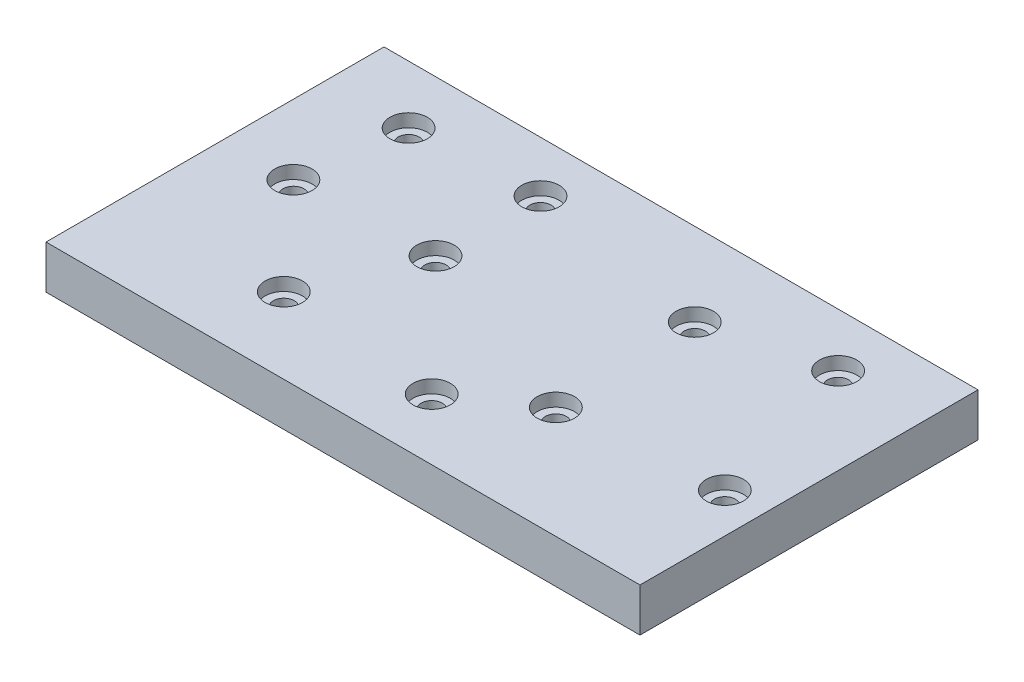
ISO-10303-21;
HEADER;
FILE_DESCRIPTION(('STEP AP214'),'2;1');
FILE_NAME('part.step','',(''),(''),'','','');
FILE_SCHEMA(('AUTOMOTIVE_DESIGN { 1 0 10303 214 1 1 1 1 }'));
ENDSEC;
DATA;
#1=APPLICATION_CONTEXT('core data for automotive mechanical design processes');
#2=APPLICATION_PROTOCOL_DEFINITION('international standard','automotive_design',2000,#1);
#3=PRODUCT_CONTEXT('',#1,'mechanical');
#4=PRODUCT('Part','Part','',(#3));
#5=PRODUCT_RELATED_PRODUCT_CATEGORY('part','',(#4));
#6=PRODUCT_DEFINITION_FORMATION('','',#4);
#7=PRODUCT_DEFINITION_CONTEXT('part definition',#1,'design');
#8=PRODUCT_DEFINITION('design','',#6,#7);
#9=PRODUCT_DEFINITION_SHAPE('','',#8);
#10=(LENGTH_UNIT() NAMED_UNIT(*) SI_UNIT(.MILLI.,.METRE.));
#11=(NAMED_UNIT(*) PLANE_ANGLE_UNIT() SI_UNIT($,.RADIAN.));
#12=(NAMED_UNIT(*) SI_UNIT($,.STERADIAN.) SOLID_ANGLE_UNIT());
#13=UNCERTAINTY_MEASURE_WITH_UNIT(LENGTH_MEASURE(1.E-05),#10,'distance_accuracy_value','');
#14=(GEOMETRIC_REPRESENTATION_CONTEXT(3) GLOBAL_UNCERTAINTY_ASSIGNED_CONTEXT((#13)) GLOBAL_UNIT_ASSIGNED_CONTEXT((#10,
#11,#12)) REPRESENTATION_CONTEXT('',''));
#15=CARTESIAN_POINT('',(0.,0.,0.));
#16=DIRECTION('',(0.,0.,1.));
#17=DIRECTION('',(1.,0.,0.));
#18=AXIS2_PLACEMENT_3D('',#15,#16,#17);
#19=CARTESIAN_POINT('',(22.2457274219153,0.,-19.8149029023021));
#20=DIRECTION('',(0.,1.,0.));
#21=DIRECTION('',(0.,0.,1.));
#22=AXIS2_PLACEMENT_3D('',#19,#20,#21);
#23=CYLINDRICAL_SURFACE('',#22,2.41627190494507);
#24=CARTESIAN_POINT('',(22.2457274219153,0.,-19.8149029023021));
#25=DIRECTION('',(0.,1.,0.));
#26=DIRECTION('',(0.,0.,1.));
#27=AXIS2_PLACEMENT_3D('',#24,#25,#26);
#28=CIRCLE('',#27,2.41627190494507);
#29=CARTESIAN_POINT('',(22.2457274219153,0.,-17.398630997357));
#30=VERTEX_POINT('',#29);
#31=EDGE_CURVE('E189',#30,#30,#28,.T.);
#32=ORIENTED_EDGE('',*,*,#31,.F.);
#33=EDGE_LOOP('',(#32));
#34=FACE_BOUND('',#33,.T.);
#35=CARTESIAN_POINT('',(22.2457274219153,7.,-19.8149029023021));
#36=DIRECTION('',(0.,1.,0.));
#37=DIRECTION('',(0.,0.,1.));
#38=AXIS2_PLACEMENT_3D('',#35,#36,#37);
#39=CIRCLE('',#38,2.41627190494507);
#40=CARTESIAN_POINT('',(22.2457274219153,7.,-17.398630997357));
#41=VERTEX_POINT('',#40);
#42=EDGE_CURVE('E47',#41,#41,#39,.F.);
#43=ORIENTED_EDGE('',*,*,#42,.F.);
#44=EDGE_LOOP('',(#43));
#45=FACE_BOUND('',#44,.T.);
#46=ADVANCED_FACE('F43',(#34,#45),#23,.F.);
#47=CARTESIAN_POINT('',(6.33487602081031,0.,24.8238746396869));
#48=DIRECTION('',(0.,1.,0.));
#49=DIRECTION('',(0.,0.,1.));
#50=AXIS2_PLACEMENT_3D('',#47,#48,#49);
#51=CYLINDRICAL_SURFACE('',#50,2.41627190494507);
#52=CARTESIAN_POINT('',(6.33487602081031,0.,24.8238746396869));
#53=DIRECTION('',(0.,1.,0.));
#54=DIRECTION('',(0.,0.,1.));
#55=AXIS2_PLACEMENT_3D('',#52,#53,#54);
#56=CIRCLE('',#55,2.41627190494507);
#57=CARTESIAN_POINT('',(6.33487602081031,0.,27.240146544632));
#58=VERTEX_POINT('',#57);
#59=EDGE_CURVE('E170',#58,#58,#56,.T.);
#60=ORIENTED_EDGE('',*,*,#59,.F.);
#61=EDGE_LOOP('',(#60));
#62=FACE_BOUND('',#61,.T.);
#63=CARTESIAN_POINT('',(6.33487602081031,7.,24.8238746396869));
#64=DIRECTION('',(0.,1.,0.));
#65=DIRECTION('',(0.,0.,1.));
#66=AXIS2_PLACEMENT_3D('',#63,#64,#65);
#67=CIRCLE('',#66,2.41627190494507);
#68=CARTESIAN_POINT('',(6.33487602081031,7.,27.240146544632));
#69=VERTEX_POINT('',#68);
#70=EDGE_CURVE('E163',#69,#69,#67,.F.);
#71=ORIENTED_EDGE('',*,*,#70,.F.);
#72=EDGE_LOOP('',(#71));
#73=FACE_BOUND('',#72,.T.);
#74=ADVANCED_FACE('F340',(#62,#73),#51,.F.);
#75=CARTESIAN_POINT('',(-20.7725004403315,0.,-3.1674380104052));
#76=DIRECTION('',(0.,1.,0.));
#77=DIRECTION('',(0.,0.,1.));
#78=AXIS2_PLACEMENT_3D('',#75,#76,#77);
#79=CYLINDRICAL_SURFACE('',#78,2.41627190494507);
#80=CARTESIAN_POINT('',(-20.7725004403315,0.,-3.1674380104052));
#81=DIRECTION('',(0.,1.,0.));
#82=DIRECTION('',(0.,0.,1.));
#83=AXIS2_PLACEMENT_3D('',#80,#81,#82);
#84=CIRCLE('',#83,2.41627190494507);
#85=CARTESIAN_POINT('',(-20.7725004403315,0.,-0.751166105460133));
#86=VERTEX_POINT('',#85);
#87=EDGE_CURVE('E175',#86,#86,#84,.T.);
#88=ORIENTED_EDGE('',*,*,#87,.F.);
#89=EDGE_LOOP('',(#88));
#90=FACE_BOUND('',#89,.T.);
#91=CARTESIAN_POINT('',(-20.7725004403315,7.,-3.1674380104052));
#92=DIRECTION('',(0.,1.,0.));
#93=DIRECTION('',(0.,0.,1.));
#94=AXIS2_PLACEMENT_3D('',#91,#92,#93);
#95=CIRCLE('',#94,2.41627190494507);
#96=CARTESIAN_POINT('',(-20.7725004403315,7.,-0.751166105460133));
#97=VERTEX_POINT('',#96);
#98=EDGE_CURVE('E160',#97,#97,#95,.F.);
#99=ORIENTED_EDGE('',*,*,#98,.F.);
#100=EDGE_LOOP('',(#99));
#101=FACE_BOUND('',#100,.T.);
#102=ADVANCED_FACE('F346',(#90,#101),#79,.F.);
#103=CARTESIAN_POINT('',(59.2237246596686,0.,10.2389275220074));
#104=DIRECTION('',(0.,1.,0.));
#105=DIRECTION('',(0.,0.,1.));
#106=AXIS2_PLACEMENT_3D('',#103,#104,#105);
#107=CYLINDRICAL_SURFACE('',#106,2.41627190494507);
#108=CARTESIAN_POINT('',(59.2237246596686,0.,10.2389275220074));
#109=DIRECTION('',(0.,1.,0.));
#110=DIRECTION('',(0.,0.,1.));
#111=AXIS2_PLACEMENT_3D('',#108,#109,#110);
#112=CIRCLE('',#111,2.41627190494507);
#113=CARTESIAN_POINT('',(59.2237246596686,0.,12.6551994269524));
#114=VERTEX_POINT('',#113);
#115=EDGE_CURVE('E181',#114,#114,#112,.T.);
#116=ORIENTED_EDGE('',*,*,#115,.F.);
#117=EDGE_LOOP('',(#116));
#118=FACE_BOUND('',#117,.T.);
#119=CARTESIAN_POINT('',(59.2237246596686,7.,10.2389275220074));
#120=DIRECTION('',(0.,1.,0.));
#121=DIRECTION('',(0.,0.,1.));
#122=AXIS2_PLACEMENT_3D('',#119,#120,#121);
#123=CIRCLE('',#122,2.41627190494507);
#124=CARTESIAN_POINT('',(59.2237246596686,7.,12.6551994269524));
#125=VERTEX_POINT('',#124);
#126=EDGE_CURVE('E156',#125,#125,#123,.F.);
#127=ORIENTED_EDGE('',*,*,#126,.F.);
#128=EDGE_LOOP('',(#127));
#129=FACE_BOUND('',#128,.T.);
#130=ADVANCED_FACE('F372',(#118,#129),#107,.F.);
#131=CARTESIAN_POINT('',(48.4691676941069,0.,-26.5917470175876));
#132=DIRECTION('',(0.,1.,0.));
#133=DIRECTION('',(0.,0.,1.));
#134=AXIS2_PLACEMENT_3D('',#131,#132,#133);
#135=CYLINDRICAL_SURFACE('',#134,2.41627190494507);
#136=CARTESIAN_POINT('',(48.4691676941069,0.,-26.5917470175876));
#137=DIRECTION('',(0.,1.,0.));
#138=DIRECTION('',(0.,0.,1.));
#139=AXIS2_PLACEMENT_3D('',#136,#137,#138);
#140=CIRCLE('',#139,2.41627190494507);
#141=CARTESIAN_POINT('',(48.4691676941069,0.,-24.1754751126425));
#142=VERTEX_POINT('',#141);
#143=EDGE_CURVE('E202',#142,#142,#140,.T.);
#144=ORIENTED_EDGE('',*,*,#143,.F.);
#145=EDGE_LOOP('',(#144));
#146=FACE_BOUND('',#145,.T.);
#147=CARTESIAN_POINT('',(48.4691676941069,7.,-26.5917470175876));
#148=DIRECTION('',(0.,1.,0.));
#149=DIRECTION('',(0.,0.,1.));
#150=AXIS2_PLACEMENT_3D('',#147,#148,#149);
#151=CIRCLE('',#150,2.41627190494507);
#152=CARTESIAN_POINT('',(48.4691676941069,7.,-24.1754751126425));
#153=VERTEX_POINT('',#152);
#154=EDGE_CURVE('E152',#153,#153,#151,.F.);
#155=ORIENTED_EDGE('',*,*,#154,.F.);
#156=EDGE_LOOP('',(#155));
#157=FACE_BOUND('',#156,.T.);
#158=ADVANCED_FACE('F356',(#146,#157),#135,.F.);
#159=CARTESIAN_POINT('',(-31.0850893114181,0.,21.4354525820442));
#160=DIRECTION('',(0.,1.,0.));
#161=DIRECTION('',(0.,0.,1.));
#162=AXIS2_PLACEMENT_3D('',#159,#160,#161);
#163=CYLINDRICAL_SURFACE('',#162,2.41627190494507);
#164=CARTESIAN_POINT('',(-31.0850893114181,0.,21.4354525820442));
#165=DIRECTION('',(0.,1.,0.));
#166=DIRECTION('',(0.,0.,1.));
#167=AXIS2_PLACEMENT_3D('',#164,#165,#166);
#168=CIRCLE('',#167,2.41627190494507);
#169=CARTESIAN_POINT('',(-31.0850893114181,0.,23.8517244869893));
#170=VERTEX_POINT('',#169);
#171=EDGE_CURVE('E198',#170,#170,#168,.T.);
#172=ORIENTED_EDGE('',*,*,#171,.F.);
#173=EDGE_LOOP('',(#172));
#174=FACE_BOUND('',#173,.T.);
#175=CARTESIAN_POINT('',(-31.0850893114181,7.,21.4354525820442));
#176=DIRECTION('',(0.,1.,0.));
#177=DIRECTION('',(0.,0.,1.));
#178=AXIS2_PLACEMENT_3D('',#175,#176,#177);
#179=CIRCLE('',#178,2.41627190494507);
#180=CARTESIAN_POINT('',(-31.0850893114181,7.,23.8517244869893));
#181=VERTEX_POINT('',#180);
#182=EDGE_CURVE('E148',#181,#181,#179,.F.);
#183=ORIENTED_EDGE('',*,*,#182,.F.);
#184=EDGE_LOOP('',(#183));
#185=FACE_BOUND('',#184,.T.);
#186=ADVANCED_FACE('F352',(#174,#185),#163,.F.);
#187=CARTESIAN_POINT('',(-52.2995578462248,0.,-1.98885642513816));
#188=DIRECTION('',(0.,1.,0.));
#189=DIRECTION('',(0.,0.,1.));
#190=AXIS2_PLACEMENT_3D('',#187,#188,#189);
#191=CYLINDRICAL_SURFACE('',#190,2.41627190494507);
#192=CARTESIAN_POINT('',(-52.2995578462248,0.,-1.98885642513816));
#193=DIRECTION('',(0.,1.,0.));
#194=DIRECTION('',(0.,0.,1.));
#195=AXIS2_PLACEMENT_3D('',#192,#193,#194);
#196=CIRCLE('',#195,2.41627190494507);
#197=CARTESIAN_POINT('',(-52.2995578462248,0.,0.427415479806901));
#198=VERTEX_POINT('',#197);
#199=EDGE_CURVE('E194',#198,#198,#196,.T.);
#200=ORIENTED_EDGE('',*,*,#199,.F.);
#201=EDGE_LOOP('',(#200));
#202=FACE_BOUND('',#201,.T.);
#203=CARTESIAN_POINT('',(-52.2995578462248,7.,-1.98885642513816));
#204=DIRECTION('',(0.,1.,0.));
#205=DIRECTION('',(0.,0.,1.));
#206=AXIS2_PLACEMENT_3D('',#203,#204,#205);
#207=CIRCLE('',#206,2.41627190494507);
#208=CARTESIAN_POINT('',(-52.2995578462248,7.,0.427415479806901));
#209=VERTEX_POINT('',#208);
#210=EDGE_CURVE('E144',#209,#209,#207,.F.);
#211=ORIENTED_EDGE('',*,*,#210,.F.);
#212=EDGE_LOOP('',(#211));
#213=FACE_BOUND('',#212,.T.);
#214=ADVANCED_FACE('F355',(#202,#213),#191,.F.);
#215=CARTESIAN_POINT('',(-20.6251777421732,0.,-27.1810378102211));
#216=DIRECTION('',(0.,1.,0.));
#217=DIRECTION('',(0.,0.,1.));
#218=AXIS2_PLACEMENT_3D('',#215,#216,#217);
#219=CYLINDRICAL_SURFACE('',#218,2.41627190494507);
#220=CARTESIAN_POINT('',(-20.6251777421732,0.,-27.1810378102211));
#221=DIRECTION('',(0.,1.,0.));
#222=DIRECTION('',(0.,0.,1.));
#223=AXIS2_PLACEMENT_3D('',#220,#221,#222);
#224=CIRCLE('',#223,2.41627190494507);
#225=CARTESIAN_POINT('',(-20.6251777421732,0.,-24.764765905276));
#226=VERTEX_POINT('',#225);
#227=EDGE_CURVE('E190',#226,#226,#224,.T.);
#228=ORIENTED_EDGE('',*,*,#227,.F.);
#229=EDGE_LOOP('',(#228));
#230=FACE_BOUND('',#229,.T.);
#231=CARTESIAN_POINT('',(-20.6251777421732,7.,-27.1810378102211));
#232=DIRECTION('',(0.,1.,0.));
#233=DIRECTION('',(0.,0.,1.));
#234=AXIS2_PLACEMENT_3D('',#231,#232,#233);
#235=CIRCLE('',#234,2.41627190494507);
#236=CARTESIAN_POINT('',(-20.6251777421732,7.,-24.764765905276));
#237=VERTEX_POINT('',#236);
#238=EDGE_CURVE('E139',#237,#237,#235,.F.);
#239=ORIENTED_EDGE('',*,*,#238,.F.);
#240=EDGE_LOOP('',(#239));
#241=FACE_BOUND('',#240,.T.);
#242=ADVANCED_FACE('F360',(#230,#241),#219,.F.);
#243=CARTESIAN_POINT('',(23.276986309024,0.,13.1853814851749));
#244=DIRECTION('',(0.,1.,0.));
#245=DIRECTION('',(0.,0.,1.));
#246=AXIS2_PLACEMENT_3D('',#243,#244,#245);
#247=CYLINDRICAL_SURFACE('',#246,2.41627190494507);
#248=CARTESIAN_POINT('',(23.276986309024,0.,13.1853814851749));
#249=DIRECTION('',(0.,1.,0.));
#250=DIRECTION('',(0.,0.,1.));
#251=AXIS2_PLACEMENT_3D('',#248,#249,#250);
#252=CIRCLE('',#251,2.41627190494507);
#253=CARTESIAN_POINT('',(23.276986309024,0.,15.60165339012));
#254=VERTEX_POINT('',#253);
#255=EDGE_CURVE('E185',#254,#254,#252,.T.);
#256=ORIENTED_EDGE('',*,*,#255,.F.);
#257=EDGE_LOOP('',(#256));
#258=FACE_BOUND('',#257,.T.);
#259=CARTESIAN_POINT('',(23.276986309024,7.,13.1853814851749));
#260=DIRECTION('',(0.,1.,0.));
#261=DIRECTION('',(0.,0.,1.));
#262=AXIS2_PLACEMENT_3D('',#259,#260,#261);
#263=CIRCLE('',#262,2.41627190494507);
#264=CARTESIAN_POINT('',(23.276986309024,7.,15.60165339012));
#265=VERTEX_POINT('',#264);
#266=EDGE_CURVE('E135',#265,#265,#263,.F.);
#267=ORIENTED_EDGE('',*,*,#266,.F.);
#268=EDGE_LOOP('',(#267));
#269=FACE_BOUND('',#268,.T.);
#270=ADVANCED_FACE('F364',(#258,#269),#247,.F.);
#271=CARTESIAN_POINT('',(-49.3531038830572,0.,-25.5604881304789));
#272=DIRECTION('',(0.,1.,0.));
#273=DIRECTION('',(0.,0.,1.));
#274=AXIS2_PLACEMENT_3D('',#271,#272,#273);
#275=CYLINDRICAL_SURFACE('',#274,2.41627190494507);
#276=CARTESIAN_POINT('',(-49.3531038830572,0.,-25.5604881304789));
#277=DIRECTION('',(0.,1.,0.));
#278=DIRECTION('',(0.,0.,1.));
#279=AXIS2_PLACEMENT_3D('',#276,#277,#278);
#280=CIRCLE('',#279,2.41627190494507);
#281=CARTESIAN_POINT('',(-49.3531038830572,0.,-23.1442162255338));
#282=VERTEX_POINT('',#281);
#283=EDGE_CURVE('E119',#282,#282,#280,.T.);
#284=ORIENTED_EDGE('',*,*,#283,.F.);
#285=EDGE_LOOP('',(#284));
#286=FACE_BOUND('',#285,.T.);
#287=CARTESIAN_POINT('',(-49.3531038830572,7.,-25.5604881304789));
#288=DIRECTION('',(0.,1.,0.));
#289=DIRECTION('',(0.,0.,1.));
#290=AXIS2_PLACEMENT_3D('',#287,#288,#289);
#291=CIRCLE('',#290,2.41627190494507);
#292=CARTESIAN_POINT('',(-49.3531038830572,7.,-23.1442162255338));
#293=VERTEX_POINT('',#292);
#294=EDGE_CURVE('E130',#293,#293,#291,.F.);
#295=ORIENTED_EDGE('',*,*,#294,.F.);
#296=EDGE_LOOP('',(#295));
#297=FACE_BOUND('',#296,.T.);
#298=ADVANCED_FACE('F367',(#286,#297),#275,.F.);
#299=CARTESIAN_POINT('',(68.3555451241874,10.,-38.8972695449242));
#300=DIRECTION('',(-1.,0.,0.));
#301=DIRECTION('',(0.,0.,1.));
#302=AXIS2_PLACEMENT_3D('',#299,#300,#301);
#303=PLANE('',#302);
#304=DIRECTION('',(0.,0.,-1.));
#305=VECTOR('',#304,1.);
#306=CARTESIAN_POINT('',(68.3555451241874,0.,-38.8972695449242));
#307=LINE('',#306,#305);
#308=CARTESIAN_POINT('',(68.3555451241874,0.,38.8972695449242));
#309=VERTEX_POINT('',#308);
#310=CARTESIAN_POINT('',(68.3555451241874,0.,-38.8972695449242));
#311=VERTEX_POINT('',#310);
#312=EDGE_CURVE('E115',#309,#311,#307,.T.);
#313=ORIENTED_EDGE('',*,*,#312,.T.);
#314=DIRECTION('',(0.,-1.,0.));
#315=VECTOR('',#314,1.);
#316=CARTESIAN_POINT('',(68.3555451241874,10.,-38.8972695449242));
#317=LINE('',#316,#315);
#318=CARTESIAN_POINT('',(68.3555451241874,10.,-38.8972695449242));
#319=VERTEX_POINT('',#318);
#320=EDGE_CURVE('E11',#319,#311,#317,.T.);
#321=ORIENTED_EDGE('',*,*,#320,.F.);
#322=DIRECTION('',(0.,0.,-1.));
#323=VECTOR('',#322,1.);
#324=CARTESIAN_POINT('',(68.3555451241874,10.,-38.8972695449242));
#325=LINE('',#324,#323);
#326=CARTESIAN_POINT('',(68.3555451241874,10.,38.8972695449242));
#327=VERTEX_POINT('',#326);
#328=EDGE_CURVE('E98',#327,#319,#325,.T.);
#329=ORIENTED_EDGE('',*,*,#328,.F.);
#330=DIRECTION('',(0.,-1.,0.));
#331=VECTOR('',#330,1.);
#332=CARTESIAN_POINT('',(68.3555451241874,10.,38.8972695449242));
#333=LINE('',#332,#331);
#334=EDGE_CURVE('E111',#327,#309,#333,.T.);
#335=ORIENTED_EDGE('',*,*,#334,.T.);
#336=EDGE_LOOP('',(#313,#321,#329,#335));
#337=FACE_BOUND('',#336,.T.);
#338=ADVANCED_FACE('F45',(#337),#303,.F.);
#339=CARTESIAN_POINT('',(-68.3555451241874,10.,-38.8972695449242));
#340=DIRECTION('',(0.,0.,1.));
#341=DIRECTION('',(1.,0.,0.));
#342=AXIS2_PLACEMENT_3D('',#339,#340,#341);
#343=PLANE('',#342);
#344=DIRECTION('',(-1.,0.,0.));
#345=VECTOR('',#344,1.);
#346=CARTESIAN_POINT('',(-68.3555451241874,0.,-38.8972695449242));
#347=LINE('',#346,#345);
#348=CARTESIAN_POINT('',(-68.3555451241874,0.,-38.8972695449242));
#349=VERTEX_POINT('',#348);
#350=EDGE_CURVE('E103',#311,#349,#347,.T.);
#351=ORIENTED_EDGE('',*,*,#350,.T.);
#352=DIRECTION('',(0.,-1.,0.));
#353=VECTOR('',#352,1.);
#354=CARTESIAN_POINT('',(-68.3555451241874,10.,-38.8972695449242));
#355=LINE('',#354,#353);
#356=CARTESIAN_POINT('',(-68.3555451241874,10.,-38.8972695449242));
#357=VERTEX_POINT('',#356);
#358=EDGE_CURVE('E54',#357,#349,#355,.T.);
#359=ORIENTED_EDGE('',*,*,#358,.F.);
#360=DIRECTION('',(-1.,0.,0.));
#361=VECTOR('',#360,1.);
#362=CARTESIAN_POINT('',(-68.3555451241874,10.,-38.8972695449242));
#363=LINE('',#362,#361);
#364=EDGE_CURVE('E93',#319,#357,#363,.T.);
#365=ORIENTED_EDGE('',*,*,#364,.F.);
#366=ORIENTED_EDGE('',*,*,#320,.T.);
#367=EDGE_LOOP('',(#351,#359,#365,#366));
#368=FACE_BOUND('',#367,.T.);
#369=ADVANCED_FACE('F102',(#368),#343,.F.);
#370=CARTESIAN_POINT('',(-68.3555451241874,10.,-38.8972695449242));
#371=DIRECTION('',(1.,0.,0.));
#372=DIRECTION('',(0.,0.,-1.));
#373=AXIS2_PLACEMENT_3D('',#370,#371,#372);
#374=PLANE('',#373);
#375=DIRECTION('',(0.,0.,1.));
#376=VECTOR('',#375,1.);
#377=CARTESIAN_POINT('',(-68.3555451241874,0.,-38.8972695449242));
#378=LINE('',#377,#376);
#379=CARTESIAN_POINT('',(-68.3555451241874,0.,38.8972695449242));
#380=VERTEX_POINT('',#379);
#381=EDGE_CURVE('E80',#349,#380,#378,.T.);
#382=ORIENTED_EDGE('',*,*,#381,.T.);
#383=DIRECTION('',(0.,-1.,0.));
#384=VECTOR('',#383,1.);
#385=CARTESIAN_POINT('',(-68.3555451241874,10.,38.8972695449242));
#386=LINE('',#385,#384);
#387=CARTESIAN_POINT('',(-68.3555451241874,10.,38.8972695449242));
#388=VERTEX_POINT('',#387);
#389=EDGE_CURVE('E105',#388,#380,#386,.T.);
#390=ORIENTED_EDGE('',*,*,#389,.F.);
#391=DIRECTION('',(0.,0.,1.));
#392=VECTOR('',#391,1.);
#393=CARTESIAN_POINT('',(-68.3555451241874,10.,-38.8972695449242));
#394=LINE('',#393,#392);
#395=EDGE_CURVE('E96',#357,#388,#394,.T.);
#396=ORIENTED_EDGE('',*,*,#395,.F.);
#397=ORIENTED_EDGE('',*,*,#358,.T.);
#398=EDGE_LOOP('',(#382,#390,#396,#397));
#399=FACE_BOUND('',#398,.T.);
#400=ADVANCED_FACE('F107',(#399),#374,.F.);
#401=CARTESIAN_POINT('',(-68.3555451241874,10.,38.8972695449242));
#402=DIRECTION('',(0.,0.,-1.));
#403=DIRECTION('',(-1.,0.,0.));
#404=AXIS2_PLACEMENT_3D('',#401,#402,#403);
#405=PLANE('',#404);
#406=DIRECTION('',(1.,0.,0.));
#407=VECTOR('',#406,1.);
#408=CARTESIAN_POINT('',(-68.3555451241874,0.,38.8972695449242));
#409=LINE('',#408,#407);
#410=EDGE_CURVE('E86',#380,#309,#409,.T.);
#411=ORIENTED_EDGE('',*,*,#410,.T.);
#412=ORIENTED_EDGE('',*,*,#334,.F.);
#413=DIRECTION('',(1.,0.,0.));
#414=VECTOR('',#413,1.);
#415=CARTESIAN_POINT('',(-68.3555451241874,10.,38.8972695449242));
#416=LINE('',#415,#414);
#417=EDGE_CURVE('E63',#388,#327,#416,.T.);
#418=ORIENTED_EDGE('',*,*,#417,.F.);
#419=ORIENTED_EDGE('',*,*,#389,.T.);
#420=EDGE_LOOP('',(#411,#412,#418,#419));
#421=FACE_BOUND('',#420,.T.);
#422=ADVANCED_FACE('F309',(#421),#405,.F.);
#423=CARTESIAN_POINT('',(0.,10.,0.));
#424=DIRECTION('',(0.,1.,0.));
#425=DIRECTION('',(0.,0.,1.));
#426=AXIS2_PLACEMENT_3D('',#423,#424,#425);
#427=PLANE('',#426);
#428=CARTESIAN_POINT('',(23.276986309024,10.,13.1853814851749));
#429=DIRECTION('',(0.,1.,0.));
#430=DIRECTION('',(0.,0.,1.));
#431=AXIS2_PLACEMENT_3D('',#428,#429,#430);
#432=CIRCLE('',#431,4.30327480478796);
#433=CARTESIAN_POINT('',(23.276986309024,10.,17.4886562899629));
#434=VERTEX_POINT('',#433);
#435=EDGE_CURVE('E257',#434,#434,#432,.T.);
#436=ORIENTED_EDGE('',*,*,#435,.F.);
#437=EDGE_LOOP('',(#436));
#438=FACE_BOUND('',#437,.T.);
#439=CARTESIAN_POINT('',(-20.6251777421732,10.,-27.1810378102211));
#440=DIRECTION('',(0.,1.,0.));
#441=DIRECTION('',(0.,0.,1.));
#442=AXIS2_PLACEMENT_3D('',#439,#440,#441);
#443=CIRCLE('',#442,4.30327480478796);
#444=CARTESIAN_POINT('',(-20.6251777421732,10.,-22.8777630054331));
#445=VERTEX_POINT('',#444);
#446=EDGE_CURVE('E249',#445,#445,#443,.T.);
#447=ORIENTED_EDGE('',*,*,#446,.F.);
#448=EDGE_LOOP('',(#447));
#449=FACE_BOUND('',#448,.T.);
#450=CARTESIAN_POINT('',(-52.2995578462248,10.,-1.98885642513816));
#451=DIRECTION('',(0.,1.,0.));
#452=DIRECTION('',(0.,0.,1.));
#453=AXIS2_PLACEMENT_3D('',#450,#451,#452);
#454=CIRCLE('',#453,4.30327480478796);
#455=CARTESIAN_POINT('',(-52.2995578462248,10.,2.31441837964979));
#456=VERTEX_POINT('',#455);
#457=EDGE_CURVE('E241',#456,#456,#454,.T.);
#458=ORIENTED_EDGE('',*,*,#457,.F.);
#459=EDGE_LOOP('',(#458));
#460=FACE_BOUND('',#459,.T.);
#461=CARTESIAN_POINT('',(-31.0850893114181,10.,21.4354525820442));
#462=DIRECTION('',(0.,1.,0.));
#463=DIRECTION('',(0.,0.,1.));
#464=AXIS2_PLACEMENT_3D('',#461,#462,#463);
#465=CIRCLE('',#464,4.30327480478796);
#466=CARTESIAN_POINT('',(-31.0850893114181,10.,25.7387273868322));
#467=VERTEX_POINT('',#466);
#468=EDGE_CURVE('E232',#467,#467,#465,.T.);
#469=ORIENTED_EDGE('',*,*,#468,.F.);
#470=EDGE_LOOP('',(#469));
#471=FACE_BOUND('',#470,.T.);
#472=CARTESIAN_POINT('',(48.4691676941069,10.,-26.5917470175876));
#473=DIRECTION('',(0.,1.,0.));
#474=DIRECTION('',(0.,0.,1.));
#475=AXIS2_PLACEMENT_3D('',#472,#473,#474);
#476=CIRCLE('',#475,4.30327480478796);
#477=CARTESIAN_POINT('',(48.4691676941069,10.,-22.2884722127996));
#478=VERTEX_POINT('',#477);
#479=EDGE_CURVE('E288',#478,#478,#476,.T.);
#480=ORIENTED_EDGE('',*,*,#479,.F.);
#481=EDGE_LOOP('',(#480));
#482=FACE_BOUND('',#481,.T.);
#483=CARTESIAN_POINT('',(59.2237246596686,10.,10.2389275220074));
#484=DIRECTION('',(0.,1.,0.));
#485=DIRECTION('',(0.,0.,1.));
#486=AXIS2_PLACEMENT_3D('',#483,#484,#485);
#487=CIRCLE('',#486,4.30327480478796);
#488=CARTESIAN_POINT('',(59.2237246596686,10.,14.5422023267953));
#489=VERTEX_POINT('',#488);
#490=EDGE_CURVE('E280',#489,#489,#487,.T.);
#491=ORIENTED_EDGE('',*,*,#490,.F.);
#492=EDGE_LOOP('',(#491));
#493=FACE_BOUND('',#492,.T.);
#494=CARTESIAN_POINT('',(-20.7725004403315,10.,-3.1674380104052));
#495=DIRECTION('',(0.,1.,0.));
#496=DIRECTION('',(0.,0.,1.));
#497=AXIS2_PLACEMENT_3D('',#494,#495,#496);
#498=CIRCLE('',#497,4.30327480478796);
#499=CARTESIAN_POINT('',(-20.7725004403315,10.,1.13583679438276));
#500=VERTEX_POINT('',#499);
#501=EDGE_CURVE('E272',#500,#500,#498,.T.);
#502=ORIENTED_EDGE('',*,*,#501,.F.);
#503=EDGE_LOOP('',(#502));
#504=FACE_BOUND('',#503,.T.);
#505=CARTESIAN_POINT('',(6.33487602081031,10.,24.8238746396869));
#506=DIRECTION('',(0.,1.,0.));
#507=DIRECTION('',(0.,0.,1.));
#508=AXIS2_PLACEMENT_3D('',#505,#506,#507);
#509=CIRCLE('',#508,4.30327480478796);
#510=CARTESIAN_POINT('',(6.33487602081031,10.,29.1271494444749));
#511=VERTEX_POINT('',#510);
#512=EDGE_CURVE('E264',#511,#511,#509,.T.);
#513=ORIENTED_EDGE('',*,*,#512,.F.);
#514=EDGE_LOOP('',(#513));
#515=FACE_BOUND('',#514,.T.);
#516=CARTESIAN_POINT('',(22.2457274219153,10.,-19.8149029023021));
#517=DIRECTION('',(0.,1.,0.));
#518=DIRECTION('',(0.,0.,1.));
#519=AXIS2_PLACEMENT_3D('',#516,#517,#518);
#520=CIRCLE('',#519,4.30327480478796);
#521=CARTESIAN_POINT('',(22.2457274219153,10.,-15.5116280975142));
#522=VERTEX_POINT('',#521);
#523=EDGE_CURVE('E224',#522,#522,#520,.T.);
#524=ORIENTED_EDGE('',*,*,#523,.F.);
#525=EDGE_LOOP('',(#524));
#526=FACE_BOUND('',#525,.T.);
#527=CARTESIAN_POINT('',(-49.3531038830572,10.,-25.5604881304789));
#528=DIRECTION('',(0.,1.,0.));
#529=DIRECTION('',(0.,0.,1.));
#530=AXIS2_PLACEMENT_3D('',#527,#528,#529);
#531=CIRCLE('',#530,4.30327480478796);
#532=CARTESIAN_POINT('',(-49.3531038830572,10.,-21.257213325691));
#533=VERTEX_POINT('',#532);
#534=EDGE_CURVE('E206',#533,#533,#531,.T.);
#535=ORIENTED_EDGE('',*,*,#534,.F.);
#536=EDGE_LOOP('',(#535));
#537=FACE_BOUND('',#536,.T.);
#538=ORIENTED_EDGE('',*,*,#328,.T.);
#539=ORIENTED_EDGE('',*,*,#364,.T.);
#540=ORIENTED_EDGE('',*,*,#395,.T.);
#541=ORIENTED_EDGE('',*,*,#417,.T.);
#542=EDGE_LOOP('',(#538,#539,#540,#541));
#543=FACE_BOUND('',#542,.T.);
#544=ADVANCED_FACE('F94',(#438,#449,#460,#471,#482,#493,#504,#515,#526,#537,#543),#427,.T.);
#545=CARTESIAN_POINT('',(0.,0.,0.));
#546=DIRECTION('',(0.,1.,0.));
#547=DIRECTION('',(0.,0.,1.));
#548=AXIS2_PLACEMENT_3D('',#545,#546,#547);
#549=PLANE('',#548);
#550=ORIENTED_EDGE('',*,*,#255,.T.);
#551=EDGE_LOOP('',(#550));
#552=FACE_BOUND('',#551,.T.);
#553=ORIENTED_EDGE('',*,*,#227,.T.);
#554=EDGE_LOOP('',(#553));
#555=FACE_BOUND('',#554,.T.);
#556=ORIENTED_EDGE('',*,*,#199,.T.);
#557=EDGE_LOOP('',(#556));
#558=FACE_BOUND('',#557,.T.);
#559=ORIENTED_EDGE('',*,*,#171,.T.);
#560=EDGE_LOOP('',(#559));
#561=FACE_BOUND('',#560,.T.);
#562=ORIENTED_EDGE('',*,*,#143,.T.);
#563=EDGE_LOOP('',(#562));
#564=FACE_BOUND('',#563,.T.);
#565=ORIENTED_EDGE('',*,*,#115,.T.);
#566=EDGE_LOOP('',(#565));
#567=FACE_BOUND('',#566,.T.);
#568=ORIENTED_EDGE('',*,*,#87,.T.);
#569=EDGE_LOOP('',(#568));
#570=FACE_BOUND('',#569,.T.);
#571=ORIENTED_EDGE('',*,*,#59,.T.);
#572=EDGE_LOOP('',(#571));
#573=FACE_BOUND('',#572,.T.);
#574=ORIENTED_EDGE('',*,*,#31,.T.);
#575=EDGE_LOOP('',(#574));
#576=FACE_BOUND('',#575,.T.);
#577=ORIENTED_EDGE('',*,*,#283,.T.);
#578=EDGE_LOOP('',(#577));
#579=FACE_BOUND('',#578,.T.);
#580=ORIENTED_EDGE('',*,*,#312,.F.);
#581=ORIENTED_EDGE('',*,*,#410,.F.);
#582=ORIENTED_EDGE('',*,*,#381,.F.);
#583=ORIENTED_EDGE('',*,*,#350,.F.);
#584=EDGE_LOOP('',(#580,#581,#582,#583));
#585=FACE_BOUND('',#584,.T.);
#586=ADVANCED_FACE('F308',(#552,#555,#558,#561,#564,#567,#570,#573,#576,#579,#585),#549,.F.);
#587=CARTESIAN_POINT('',(-49.3531038830572,7.,-25.5604881304789));
#588=DIRECTION('',(0.,1.,0.));
#589=DIRECTION('',(0.,0.,1.));
#590=AXIS2_PLACEMENT_3D('',#587,#588,#589);
#591=PLANE('',#590);
#592=CARTESIAN_POINT('',(-49.3531038830572,7.,-25.5604881304789));
#593=DIRECTION('',(0.,1.,0.));
#594=DIRECTION('',(0.,0.,1.));
#595=AXIS2_PLACEMENT_3D('',#592,#593,#594);
#596=CIRCLE('',#595,4.30327480478796);
#597=CARTESIAN_POINT('',(-49.3531038830572,7.,-21.257213325691));
#598=VERTEX_POINT('',#597);
#599=EDGE_CURVE('E134',#598,#598,#596,.T.);
#600=ORIENTED_EDGE('',*,*,#599,.T.);
#601=EDGE_LOOP('',(#600));
#602=FACE_BOUND('',#601,.T.);
#603=ORIENTED_EDGE('',*,*,#294,.T.);
#604=EDGE_LOOP('',(#603));
#605=FACE_BOUND('',#604,.T.);
#606=ADVANCED_FACE('F325',(#602,#605),#591,.T.);
#607=CARTESIAN_POINT('',(-49.3531038830572,7.,-25.5604881304789));
#608=DIRECTION('',(0.,1.,0.));
#609=DIRECTION('',(0.,0.,1.));
#610=AXIS2_PLACEMENT_3D('',#607,#608,#609);
#611=CYLINDRICAL_SURFACE('',#610,4.30327480478796);
#612=ORIENTED_EDGE('',*,*,#599,.F.);
#613=EDGE_LOOP('',(#612));
#614=FACE_BOUND('',#613,.T.);
#615=ORIENTED_EDGE('',*,*,#534,.T.);
#616=EDGE_LOOP('',(#615));
#617=FACE_BOUND('',#616,.T.);
#618=ADVANCED_FACE('F322',(#614,#617),#611,.F.);
#619=CARTESIAN_POINT('',(23.276986309024,7.,13.1853814851749));
#620=DIRECTION('',(0.,1.,0.));
#621=DIRECTION('',(0.,0.,1.));
#622=AXIS2_PLACEMENT_3D('',#619,#620,#621);
#623=PLANE('',#622);
#624=CARTESIAN_POINT('',(23.276986309024,7.,13.1853814851749));
#625=DIRECTION('',(0.,1.,0.));
#626=DIRECTION('',(0.,0.,1.));
#627=AXIS2_PLACEMENT_3D('',#624,#625,#626);
#628=CIRCLE('',#627,4.30327480478796);
#629=CARTESIAN_POINT('',(23.276986309024,7.,17.4886562899629));
#630=VERTEX_POINT('',#629);
#631=EDGE_CURVE('E228',#630,#630,#628,.T.);
#632=ORIENTED_EDGE('',*,*,#631,.T.);
#633=EDGE_LOOP('',(#632));
#634=FACE_BOUND('',#633,.T.);
#635=ORIENTED_EDGE('',*,*,#266,.T.);
#636=EDGE_LOOP('',(#635));
#637=FACE_BOUND('',#636,.T.);
#638=ADVANCED_FACE('F324',(#634,#637),#623,.T.);
#639=CARTESIAN_POINT('',(23.276986309024,7.,13.1853814851749));
#640=DIRECTION('',(0.,1.,0.));
#641=DIRECTION('',(0.,0.,1.));
#642=AXIS2_PLACEMENT_3D('',#639,#640,#641);
#643=CYLINDRICAL_SURFACE('',#642,4.30327480478796);
#644=ORIENTED_EDGE('',*,*,#631,.F.);
#645=EDGE_LOOP('',(#644));
#646=FACE_BOUND('',#645,.T.);
#647=ORIENTED_EDGE('',*,*,#435,.T.);
#648=EDGE_LOOP('',(#647));
#649=FACE_BOUND('',#648,.T.);
#650=ADVANCED_FACE('F332',(#646,#649),#643,.F.);
#651=CARTESIAN_POINT('',(-20.6251777421732,7.,-27.1810378102211));
#652=DIRECTION('',(0.,1.,0.));
#653=DIRECTION('',(0.,0.,1.));
#654=AXIS2_PLACEMENT_3D('',#651,#652,#653);
#655=PLANE('',#654);
#656=CARTESIAN_POINT('',(-20.6251777421732,7.,-27.1810378102211));
#657=DIRECTION('',(0.,1.,0.));
#658=DIRECTION('',(0.,0.,1.));
#659=AXIS2_PLACEMENT_3D('',#656,#657,#658);
#660=CIRCLE('',#659,4.30327480478796);
#661=CARTESIAN_POINT('',(-20.6251777421732,7.,-22.8777630054331));
#662=VERTEX_POINT('',#661);
#663=EDGE_CURVE('E253',#662,#662,#660,.T.);
#664=ORIENTED_EDGE('',*,*,#663,.T.);
#665=EDGE_LOOP('',(#664));
#666=FACE_BOUND('',#665,.T.);
#667=ORIENTED_EDGE('',*,*,#238,.T.);
#668=EDGE_LOOP('',(#667));
#669=FACE_BOUND('',#668,.T.);
#670=ADVANCED_FACE('F408',(#666,#669),#655,.T.);
#671=CARTESIAN_POINT('',(-20.6251777421732,7.,-27.1810378102211));
#672=DIRECTION('',(0.,1.,0.));
#673=DIRECTION('',(0.,0.,1.));
#674=AXIS2_PLACEMENT_3D('',#671,#672,#673);
#675=CYLINDRICAL_SURFACE('',#674,4.30327480478796);
#676=ORIENTED_EDGE('',*,*,#663,.F.);
#677=EDGE_LOOP('',(#676));
#678=FACE_BOUND('',#677,.T.);
#679=ORIENTED_EDGE('',*,*,#446,.T.);
#680=EDGE_LOOP('',(#679));
#681=FACE_BOUND('',#680,.T.);
#682=ADVANCED_FACE('F404',(#678,#681),#675,.F.);
#683=CARTESIAN_POINT('',(-52.2995578462248,7.,-1.98885642513816));
#684=DIRECTION('',(0.,1.,0.));
#685=DIRECTION('',(0.,0.,1.));
#686=AXIS2_PLACEMENT_3D('',#683,#684,#685);
#687=PLANE('',#686);
#688=CARTESIAN_POINT('',(-52.2995578462248,7.,-1.98885642513816));
#689=DIRECTION('',(0.,1.,0.));
#690=DIRECTION('',(0.,0.,1.));
#691=AXIS2_PLACEMENT_3D('',#688,#689,#690);
#692=CIRCLE('',#691,4.30327480478796);
#693=CARTESIAN_POINT('',(-52.2995578462248,7.,2.31441837964979));
#694=VERTEX_POINT('',#693);
#695=EDGE_CURVE('E245',#694,#694,#692,.T.);
#696=ORIENTED_EDGE('',*,*,#695,.T.);
#697=EDGE_LOOP('',(#696));
#698=FACE_BOUND('',#697,.T.);
#699=ORIENTED_EDGE('',*,*,#210,.T.);
#700=EDGE_LOOP('',(#699));
#701=FACE_BOUND('',#700,.T.);
#702=ADVANCED_FACE('F400',(#698,#701),#687,.T.);
#703=CARTESIAN_POINT('',(-52.2995578462248,7.,-1.98885642513816));
#704=DIRECTION('',(0.,1.,0.));
#705=DIRECTION('',(0.,0.,1.));
#706=AXIS2_PLACEMENT_3D('',#703,#704,#705);
#707=CYLINDRICAL_SURFACE('',#706,4.30327480478796);
#708=ORIENTED_EDGE('',*,*,#695,.F.);
#709=EDGE_LOOP('',(#708));
#710=FACE_BOUND('',#709,.T.);
#711=ORIENTED_EDGE('',*,*,#457,.T.);
#712=EDGE_LOOP('',(#711));
#713=FACE_BOUND('',#712,.T.);
#714=ADVANCED_FACE('F396',(#710,#713),#707,.F.);
#715=CARTESIAN_POINT('',(-31.0850893114181,7.,21.4354525820442));
#716=DIRECTION('',(0.,1.,0.));
#717=DIRECTION('',(0.,0.,1.));
#718=AXIS2_PLACEMENT_3D('',#715,#716,#717);
#719=PLANE('',#718);
#720=CARTESIAN_POINT('',(-31.0850893114181,7.,21.4354525820442));
#721=DIRECTION('',(0.,1.,0.));
#722=DIRECTION('',(0.,0.,1.));
#723=AXIS2_PLACEMENT_3D('',#720,#721,#722);
#724=CIRCLE('',#723,4.30327480478796);
#725=CARTESIAN_POINT('',(-31.0850893114181,7.,25.7387273868322));
#726=VERTEX_POINT('',#725);
#727=EDGE_CURVE('E236',#726,#726,#724,.T.);
#728=ORIENTED_EDGE('',*,*,#727,.T.);
#729=EDGE_LOOP('',(#728));
#730=FACE_BOUND('',#729,.T.);
#731=ORIENTED_EDGE('',*,*,#182,.T.);
#732=EDGE_LOOP('',(#731));
#733=FACE_BOUND('',#732,.T.);
#734=ADVANCED_FACE('F392',(#730,#733),#719,.T.);
#735=CARTESIAN_POINT('',(-31.0850893114181,7.,21.4354525820442));
#736=DIRECTION('',(0.,1.,0.));
#737=DIRECTION('',(0.,0.,1.));
#738=AXIS2_PLACEMENT_3D('',#735,#736,#737);
#739=CYLINDRICAL_SURFACE('',#738,4.30327480478796);
#740=ORIENTED_EDGE('',*,*,#727,.F.);
#741=EDGE_LOOP('',(#740));
#742=FACE_BOUND('',#741,.T.);
#743=ORIENTED_EDGE('',*,*,#468,.T.);
#744=EDGE_LOOP('',(#743));
#745=FACE_BOUND('',#744,.T.);
#746=ADVANCED_FACE('F389',(#742,#745),#739,.F.);
#747=CARTESIAN_POINT('',(48.4691676941069,7.,-26.5917470175876));
#748=DIRECTION('',(0.,1.,0.));
#749=DIRECTION('',(0.,0.,1.));
#750=AXIS2_PLACEMENT_3D('',#747,#748,#749);
#751=PLANE('',#750);
#752=CARTESIAN_POINT('',(48.4691676941069,7.,-26.5917470175876));
#753=DIRECTION('',(0.,1.,0.));
#754=DIRECTION('',(0.,0.,1.));
#755=AXIS2_PLACEMENT_3D('',#752,#753,#754);
#756=CIRCLE('',#755,4.30327480478796);
#757=CARTESIAN_POINT('',(48.4691676941069,7.,-22.2884722127996));
#758=VERTEX_POINT('',#757);
#759=EDGE_CURVE('E237',#758,#758,#756,.T.);
#760=ORIENTED_EDGE('',*,*,#759,.T.);
#761=EDGE_LOOP('',(#760));
#762=FACE_BOUND('',#761,.T.);
#763=ORIENTED_EDGE('',*,*,#154,.T.);
#764=EDGE_LOOP('',(#763));
#765=FACE_BOUND('',#764,.T.);
#766=ADVANCED_FACE('F296',(#762,#765),#751,.T.);
#767=CARTESIAN_POINT('',(48.4691676941069,7.,-26.5917470175876));
#768=DIRECTION('',(0.,1.,0.));
#769=DIRECTION('',(0.,0.,1.));
#770=AXIS2_PLACEMENT_3D('',#767,#768,#769);
#771=CYLINDRICAL_SURFACE('',#770,4.30327480478796);
#772=ORIENTED_EDGE('',*,*,#759,.F.);
#773=EDGE_LOOP('',(#772));
#774=FACE_BOUND('',#773,.T.);
#775=ORIENTED_EDGE('',*,*,#479,.T.);
#776=EDGE_LOOP('',(#775));
#777=FACE_BOUND('',#776,.T.);
#778=ADVANCED_FACE('F299',(#774,#777),#771,.F.);
#779=CARTESIAN_POINT('',(59.2237246596686,7.,10.2389275220074));
#780=DIRECTION('',(0.,1.,0.));
#781=DIRECTION('',(0.,0.,1.));
#782=AXIS2_PLACEMENT_3D('',#779,#780,#781);
#783=PLANE('',#782);
#784=CARTESIAN_POINT('',(59.2237246596686,7.,10.2389275220074));
#785=DIRECTION('',(0.,1.,0.));
#786=DIRECTION('',(0.,0.,1.));
#787=AXIS2_PLACEMENT_3D('',#784,#785,#786);
#788=CIRCLE('',#787,4.30327480478796);
#789=CARTESIAN_POINT('',(59.2237246596686,7.,14.5422023267953));
#790=VERTEX_POINT('',#789);
#791=EDGE_CURVE('E284',#790,#790,#788,.T.);
#792=ORIENTED_EDGE('',*,*,#791,.T.);
#793=EDGE_LOOP('',(#792));
#794=FACE_BOUND('',#793,.T.);
#795=ORIENTED_EDGE('',*,*,#126,.T.);
#796=EDGE_LOOP('',(#795));
#797=FACE_BOUND('',#796,.T.);
#798=ADVANCED_FACE('F302',(#794,#797),#783,.T.);
#799=CARTESIAN_POINT('',(59.2237246596686,7.,10.2389275220074));
#800=DIRECTION('',(0.,1.,0.));
#801=DIRECTION('',(0.,0.,1.));
#802=AXIS2_PLACEMENT_3D('',#799,#800,#801);
#803=CYLINDRICAL_SURFACE('',#802,4.30327480478796);
#804=ORIENTED_EDGE('',*,*,#791,.F.);
#805=EDGE_LOOP('',(#804));
#806=FACE_BOUND('',#805,.T.);
#807=ORIENTED_EDGE('',*,*,#490,.T.);
#808=EDGE_LOOP('',(#807));
#809=FACE_BOUND('',#808,.T.);
#810=ADVANCED_FACE('F430',(#806,#809),#803,.F.);
#811=CARTESIAN_POINT('',(-20.7725004403315,7.,-3.1674380104052));
#812=DIRECTION('',(0.,1.,0.));
#813=DIRECTION('',(0.,0.,1.));
#814=AXIS2_PLACEMENT_3D('',#811,#812,#813);
#815=PLANE('',#814);
#816=CARTESIAN_POINT('',(-20.7725004403315,7.,-3.1674380104052));
#817=DIRECTION('',(0.,1.,0.));
#818=DIRECTION('',(0.,0.,1.));
#819=AXIS2_PLACEMENT_3D('',#816,#817,#818);
#820=CIRCLE('',#819,4.30327480478796);
#821=CARTESIAN_POINT('',(-20.7725004403315,7.,1.13583679438276));
#822=VERTEX_POINT('',#821);
#823=EDGE_CURVE('E276',#822,#822,#820,.T.);
#824=ORIENTED_EDGE('',*,*,#823,.T.);
#825=EDGE_LOOP('',(#824));
#826=FACE_BOUND('',#825,.T.);
#827=ORIENTED_EDGE('',*,*,#98,.T.);
#828=EDGE_LOOP('',(#827));
#829=FACE_BOUND('',#828,.T.);
#830=ADVANCED_FACE('F426',(#826,#829),#815,.T.);
#831=CARTESIAN_POINT('',(-20.7725004403315,7.,-3.1674380104052));
#832=DIRECTION('',(0.,1.,0.));
#833=DIRECTION('',(0.,0.,1.));
#834=AXIS2_PLACEMENT_3D('',#831,#832,#833);
#835=CYLINDRICAL_SURFACE('',#834,4.30327480478796);
#836=ORIENTED_EDGE('',*,*,#823,.F.);
#837=EDGE_LOOP('',(#836));
#838=FACE_BOUND('',#837,.T.);
#839=ORIENTED_EDGE('',*,*,#501,.T.);
#840=EDGE_LOOP('',(#839));
#841=FACE_BOUND('',#840,.T.);
#842=ADVANCED_FACE('F422',(#838,#841),#835,.F.);
#843=CARTESIAN_POINT('',(6.33487602081031,7.,24.8238746396869));
#844=DIRECTION('',(0.,1.,0.));
#845=DIRECTION('',(0.,0.,1.));
#846=AXIS2_PLACEMENT_3D('',#843,#844,#845);
#847=PLANE('',#846);
#848=CARTESIAN_POINT('',(6.33487602081031,7.,24.8238746396869));
#849=DIRECTION('',(0.,1.,0.));
#850=DIRECTION('',(0.,0.,1.));
#851=AXIS2_PLACEMENT_3D('',#848,#849,#850);
#852=CIRCLE('',#851,4.30327480478796);
#853=CARTESIAN_POINT('',(6.33487602081031,7.,29.1271494444749));
#854=VERTEX_POINT('',#853);
#855=EDGE_CURVE('E268',#854,#854,#852,.T.);
#856=ORIENTED_EDGE('',*,*,#855,.T.);
#857=EDGE_LOOP('',(#856));
#858=FACE_BOUND('',#857,.T.);
#859=ORIENTED_EDGE('',*,*,#70,.T.);
#860=EDGE_LOOP('',(#859));
#861=FACE_BOUND('',#860,.T.);
#862=ADVANCED_FACE('F418',(#858,#861),#847,.T.);
#863=CARTESIAN_POINT('',(6.33487602081031,7.,24.8238746396869));
#864=DIRECTION('',(0.,1.,0.));
#865=DIRECTION('',(0.,0.,1.));
#866=AXIS2_PLACEMENT_3D('',#863,#864,#865);
#867=CYLINDRICAL_SURFACE('',#866,4.30327480478796);
#868=ORIENTED_EDGE('',*,*,#855,.F.);
#869=EDGE_LOOP('',(#868));
#870=FACE_BOUND('',#869,.T.);
#871=ORIENTED_EDGE('',*,*,#512,.T.);
#872=EDGE_LOOP('',(#871));
#873=FACE_BOUND('',#872,.T.);
#874=ADVANCED_FACE('F387',(#870,#873),#867,.F.);
#875=CARTESIAN_POINT('',(22.2457274219153,7.,-19.8149029023021));
#876=DIRECTION('',(0.,1.,0.));
#877=DIRECTION('',(0.,0.,1.));
#878=AXIS2_PLACEMENT_3D('',#875,#876,#877);
#879=PLANE('',#878);
#880=CARTESIAN_POINT('',(22.2457274219153,7.,-19.8149029023021));
#881=DIRECTION('',(0.,1.,0.));
#882=DIRECTION('',(0.,0.,1.));
#883=AXIS2_PLACEMENT_3D('',#880,#881,#882);
#884=CIRCLE('',#883,4.30327480478796);
#885=CARTESIAN_POINT('',(22.2457274219153,7.,-15.5116280975142));
#886=VERTEX_POINT('',#885);
#887=EDGE_CURVE('E140',#886,#886,#884,.T.);
#888=ORIENTED_EDGE('',*,*,#887,.T.);
#889=EDGE_LOOP('',(#888));
#890=FACE_BOUND('',#889,.T.);
#891=ORIENTED_EDGE('',*,*,#42,.T.);
#892=EDGE_LOOP('',(#891));
#893=FACE_BOUND('',#892,.T.);
#894=ADVANCED_FACE('F383',(#890,#893),#879,.T.);
#895=CARTESIAN_POINT('',(22.2457274219153,7.,-19.8149029023021));
#896=DIRECTION('',(0.,1.,0.));
#897=DIRECTION('',(0.,0.,1.));
#898=AXIS2_PLACEMENT_3D('',#895,#896,#897);
#899=CYLINDRICAL_SURFACE('',#898,4.30327480478796);
#900=ORIENTED_EDGE('',*,*,#887,.F.);
#901=EDGE_LOOP('',(#900));
#902=FACE_BOUND('',#901,.T.);
#903=ORIENTED_EDGE('',*,*,#523,.T.);
#904=EDGE_LOOP('',(#903));
#905=FACE_BOUND('',#904,.T.);
#906=ADVANCED_FACE('F380',(#902,#905),#899,.F.);
#907=CLOSED_SHELL('',(#46,#74,#102,#130,#158,#186,#214,#242,#270,#298,#338,#369,#400,#422,#544,
#586,#606,#618,#638,#650,#670,#682,#702,#714,#734,#746,#766,#778,#798,#810,#830,#842,#862,#874,
#894,#906));
#908=MANIFOLD_SOLID_BREP('B2',#907);
#909=ADVANCED_BREP_SHAPE_REPRESENTATION('',(#18,#908),#14);
#910=SHAPE_DEFINITION_REPRESENTATION(#9,#909);
ENDSEC;
END-ISO-10303-21;
